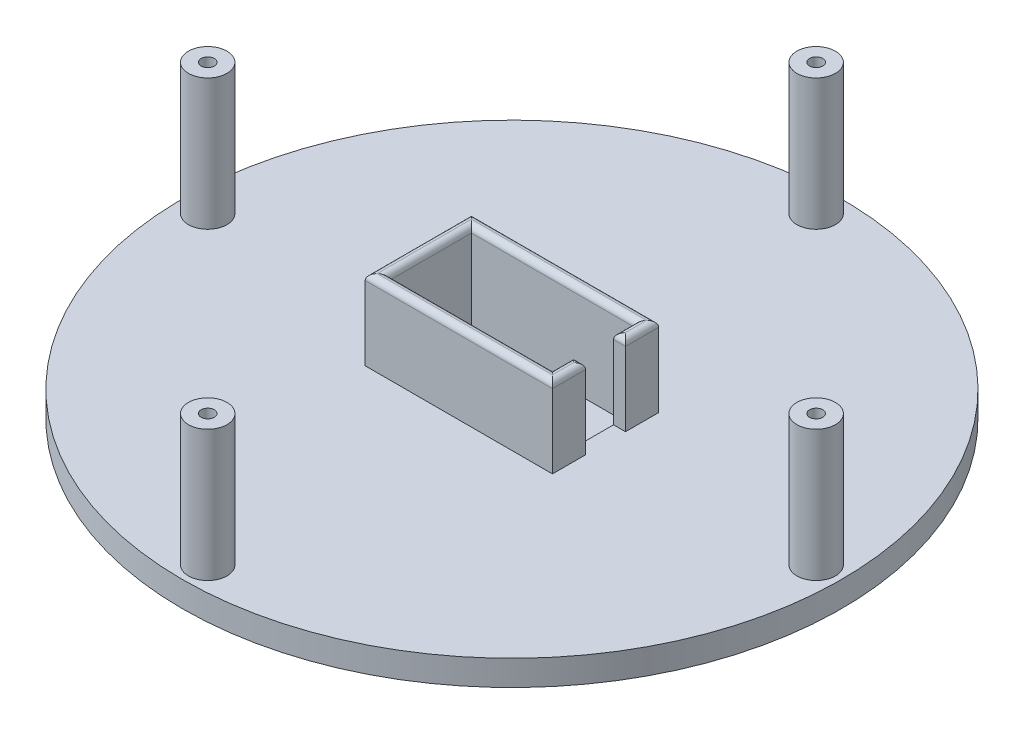
ISO-10303-21;
HEADER;
FILE_DESCRIPTION(('STEP AP214'),'2;1');
FILE_NAME('part.step','',(''),(''),'','','');
FILE_SCHEMA(('AUTOMOTIVE_DESIGN { 1 0 10303 214 1 1 1 1 }'));
ENDSEC;
DATA;
#1=APPLICATION_CONTEXT('core data for automotive mechanical design processes');
#2=APPLICATION_PROTOCOL_DEFINITION('international standard','automotive_design',2000,#1);
#3=PRODUCT_CONTEXT('',#1,'mechanical');
#4=PRODUCT('Part','Part','',(#3));
#5=PRODUCT_RELATED_PRODUCT_CATEGORY('part','',(#4));
#6=PRODUCT_DEFINITION_FORMATION('','',#4);
#7=PRODUCT_DEFINITION_CONTEXT('part definition',#1,'design');
#8=PRODUCT_DEFINITION('design','',#6,#7);
#9=PRODUCT_DEFINITION_SHAPE('','',#8);
#10=(LENGTH_UNIT() NAMED_UNIT(*) SI_UNIT(.MILLI.,.METRE.));
#11=(NAMED_UNIT(*) PLANE_ANGLE_UNIT() SI_UNIT($,.RADIAN.));
#12=(NAMED_UNIT(*) SI_UNIT($,.STERADIAN.) SOLID_ANGLE_UNIT());
#13=UNCERTAINTY_MEASURE_WITH_UNIT(LENGTH_MEASURE(1.E-05),#10,'distance_accuracy_value','');
#14=(GEOMETRIC_REPRESENTATION_CONTEXT(3) GLOBAL_UNCERTAINTY_ASSIGNED_CONTEXT((#13)) GLOBAL_UNIT_ASSIGNED_CONTEXT((#10,
#11,#12)) REPRESENTATION_CONTEXT('',''));
#15=CARTESIAN_POINT('',(0.,0.,0.));
#16=DIRECTION('',(0.,0.,1.));
#17=DIRECTION('',(1.,0.,0.));
#18=AXIS2_PLACEMENT_3D('',#15,#16,#17);
#19=CARTESIAN_POINT('',(0.,6.35,0.));
#20=DIRECTION('',(0.,1.,0.));
#21=DIRECTION('',(0.,0.,1.));
#22=AXIS2_PLACEMENT_3D('',#19,#20,#21);
#23=PLANE('',#22);
#24=CARTESIAN_POINT('',(0.,6.35,76.2));
#25=DIRECTION('',(0.,1.,0.));
#26=DIRECTION('',(0.,0.,-1.));
#27=AXIS2_PLACEMENT_3D('',#24,#25,#26);
#28=CIRCLE('',#27,4.825);
#29=CARTESIAN_POINT('',(0.,6.35,71.375));
#30=VERTEX_POINT('',#29);
#31=EDGE_CURVE('E307',#30,#30,#28,.T.);
#32=ORIENTED_EDGE('',*,*,#31,.F.);
#33=EDGE_LOOP('',(#32));
#34=FACE_BOUND('',#33,.T.);
#35=CARTESIAN_POINT('',(0.,6.35,-76.2));
#36=DIRECTION('',(0.,1.,0.));
#37=DIRECTION('',(0.,0.,1.));
#38=AXIS2_PLACEMENT_3D('',#35,#36,#37);
#39=CIRCLE('',#38,4.825);
#40=CARTESIAN_POINT('',(0.,6.35,-71.375));
#41=VERTEX_POINT('',#40);
#42=EDGE_CURVE('E289',#41,#41,#39,.T.);
#43=ORIENTED_EDGE('',*,*,#42,.F.);
#44=EDGE_LOOP('',(#43));
#45=FACE_BOUND('',#44,.T.);
#46=CARTESIAN_POINT('',(0.,6.35,0.));
#47=DIRECTION('',(0.,1.,0.));
#48=DIRECTION('',(0.,0.,1.));
#49=AXIS2_PLACEMENT_3D('',#46,#47,#48);
#50=CIRCLE('',#49,82.55);
#51=CARTESIAN_POINT('',(0.,6.35,82.55));
#52=VERTEX_POINT('',#51);
#53=EDGE_CURVE('E241',#52,#52,#50,.T.);
#54=ORIENTED_EDGE('',*,*,#53,.T.);
#55=EDGE_LOOP('',(#54));
#56=FACE_BOUND('',#55,.T.);
#57=CARTESIAN_POINT('',(76.2,6.35,-7.97374983342082E-13));
#58=DIRECTION('',(0.,1.,0.));
#59=DIRECTION('',(-1.,0.,0.));
#60=AXIS2_PLACEMENT_3D('',#57,#58,#59);
#61=CIRCLE('',#60,4.825);
#62=CARTESIAN_POINT('',(71.375,6.35,-7.46835790962327E-13));
#63=VERTEX_POINT('',#62);
#64=EDGE_CURVE('E298',#63,#63,#61,.T.);
#65=ORIENTED_EDGE('',*,*,#64,.F.);
#66=EDGE_LOOP('',(#65));
#67=FACE_BOUND('',#66,.T.);
#68=CARTESIAN_POINT('',(-76.2,6.35,2.65273227302388E-13));
#69=DIRECTION('',(0.,1.,0.));
#70=DIRECTION('',(1.,0.,0.));
#71=AXIS2_PLACEMENT_3D('',#68,#69,#70);
#72=CIRCLE('',#71,4.825);
#73=CARTESIAN_POINT('',(-71.375,6.35,2.4842682984247E-13));
#74=VERTEX_POINT('',#73);
#75=EDGE_CURVE('E316',#74,#74,#72,.T.);
#76=ORIENTED_EDGE('',*,*,#75,.F.);
#77=EDGE_LOOP('',(#76));
#78=FACE_BOUND('',#77,.T.);
#79=DIRECTION('',(0.,0.,-1.));
#80=VECTOR('',#79,1.);
#81=CARTESIAN_POINT('',(23.45,6.35,-5.));
#82=LINE('',#81,#80);
#83=CARTESIAN_POINT('',(23.45,6.35,-5.));
#84=VERTEX_POINT('',#83);
#85=CARTESIAN_POINT('',(23.45,6.35,-13.3));
#86=VERTEX_POINT('',#85);
#87=EDGE_CURVE('E174',#84,#86,#82,.T.);
#88=ORIENTED_EDGE('',*,*,#87,.F.);
#89=DIRECTION('',(1.,0.,0.));
#90=VECTOR('',#89,1.);
#91=CARTESIAN_POINT('',(20.45,6.35,-5.));
#92=LINE('',#91,#90);
#93=CARTESIAN_POINT('',(20.45,6.35,-5.));
#94=VERTEX_POINT('',#93);
#95=EDGE_CURVE('E186',#94,#84,#92,.T.);
#96=ORIENTED_EDGE('',*,*,#95,.F.);
#97=DIRECTION('',(0.,0.,-1.));
#98=VECTOR('',#97,1.);
#99=CARTESIAN_POINT('',(20.45,6.35,-10.3));
#100=LINE('',#99,#98);
#101=CARTESIAN_POINT('',(20.45,6.35,5.));
#102=VERTEX_POINT('',#101);
#103=EDGE_CURVE('E274',#102,#94,#100,.T.);
#104=ORIENTED_EDGE('',*,*,#103,.F.);
#105=DIRECTION('',(-1.,0.,0.));
#106=VECTOR('',#105,1.);
#107=CARTESIAN_POINT('',(20.45,6.35,5.));
#108=LINE('',#107,#106);
#109=CARTESIAN_POINT('',(23.45,6.35,5.));
#110=VERTEX_POINT('',#109);
#111=EDGE_CURVE('E355',#110,#102,#108,.T.);
#112=ORIENTED_EDGE('',*,*,#111,.F.);
#113=DIRECTION('',(0.,0.,-1.));
#114=VECTOR('',#113,1.);
#115=CARTESIAN_POINT('',(23.45,6.35,5.));
#116=LINE('',#115,#114);
#117=CARTESIAN_POINT('',(23.45,6.35,13.3));
#118=VERTEX_POINT('',#117);
#119=EDGE_CURVE('E358',#118,#110,#116,.T.);
#120=ORIENTED_EDGE('',*,*,#119,.F.);
#121=DIRECTION('',(1.,0.,0.));
#122=VECTOR('',#121,1.);
#123=CARTESIAN_POINT('',(-23.45,6.35,13.3));
#124=LINE('',#123,#122);
#125=CARTESIAN_POINT('',(-23.45,6.35,13.3));
#126=VERTEX_POINT('',#125);
#127=EDGE_CURVE('E361',#126,#118,#124,.T.);
#128=ORIENTED_EDGE('',*,*,#127,.F.);
#129=DIRECTION('',(0.,0.,1.));
#130=VECTOR('',#129,1.);
#131=CARTESIAN_POINT('',(-23.45,6.35,-13.3));
#132=LINE('',#131,#130);
#133=CARTESIAN_POINT('',(-23.45,6.35,-13.3));
#134=VERTEX_POINT('',#133);
#135=EDGE_CURVE('E364',#134,#126,#132,.T.);
#136=ORIENTED_EDGE('',*,*,#135,.F.);
#137=DIRECTION('',(-1.,0.,0.));
#138=VECTOR('',#137,1.);
#139=CARTESIAN_POINT('',(23.45,6.35,-13.3));
#140=LINE('',#139,#138);
#141=EDGE_CURVE('E367',#86,#134,#140,.T.);
#142=ORIENTED_EDGE('',*,*,#141,.F.);
#143=EDGE_LOOP('',(#88,#96,#104,#112,#120,#128,#136,#142));
#144=FACE_BOUND('',#143,.T.);
#145=ADVANCED_FACE('F39',(#34,#45,#56,#67,#78,#144),#23,.T.);
#146=CARTESIAN_POINT('',(0.,-0.00100000000000013,-76.2));
#147=DIRECTION('',(0.,1.,0.));
#148=DIRECTION('',(0.,0.,1.));
#149=AXIS2_PLACEMENT_3D('',#146,#147,#148);
#150=CYLINDRICAL_SURFACE('',#149,1.65);
#151=CARTESIAN_POINT('',(0.,39.174999914,-76.2));
#152=DIRECTION('',(0.,1.,0.));
#153=DIRECTION('',(0.,0.,1.));
#154=AXIS2_PLACEMENT_3D('',#151,#152,#153);
#155=CIRCLE('',#154,1.65);
#156=CARTESIAN_POINT('',(0.,39.174999914,-74.55));
#157=VERTEX_POINT('',#156);
#158=EDGE_CURVE('E292',#157,#157,#155,.T.);
#159=ORIENTED_EDGE('',*,*,#158,.T.);
#160=EDGE_LOOP('',(#159));
#161=FACE_BOUND('',#160,.T.);
#162=CARTESIAN_POINT('',(0.,20.,-76.2));
#163=DIRECTION('',(0.,-1.,0.));
#164=DIRECTION('',(0.,0.,-1.));
#165=AXIS2_PLACEMENT_3D('',#162,#163,#164);
#166=CIRCLE('',#165,1.65);
#167=CARTESIAN_POINT('',(0.,20.,-77.85));
#168=VERTEX_POINT('',#167);
#169=EDGE_CURVE('E242',#168,#168,#166,.F.);
#170=ORIENTED_EDGE('',*,*,#169,.F.);
#171=EDGE_LOOP('',(#170));
#172=FACE_BOUND('',#171,.T.);
#173=ADVANCED_FACE('F428',(#161,#172),#150,.F.);
#174=CARTESIAN_POINT('',(76.2,-0.00100000000000013,-7.97374983342082E-13));
#175=DIRECTION('',(0.,1.,0.));
#176=DIRECTION('',(0.,0.,1.));
#177=AXIS2_PLACEMENT_3D('',#174,#175,#176);
#178=CYLINDRICAL_SURFACE('',#177,1.65);
#179=CARTESIAN_POINT('',(76.2,39.174999914,-7.97374983342082E-13));
#180=DIRECTION('',(0.,1.,0.));
#181=DIRECTION('',(-1.,0.,0.));
#182=AXIS2_PLACEMENT_3D('',#179,#180,#181);
#183=CIRCLE('',#182,1.65);
#184=CARTESIAN_POINT('',(74.55,39.174999914,-7.80092150714808E-13));
#185=VERTEX_POINT('',#184);
#186=EDGE_CURVE('E256',#185,#185,#183,.T.);
#187=ORIENTED_EDGE('',*,*,#186,.T.);
#188=EDGE_LOOP('',(#187));
#189=FACE_BOUND('',#188,.T.);
#190=CARTESIAN_POINT('',(76.2,20.,-7.97374983342082E-13));
#191=DIRECTION('',(0.,-1.,0.));
#192=DIRECTION('',(0.,0.,-1.));
#193=AXIS2_PLACEMENT_3D('',#190,#191,#192);
#194=CIRCLE('',#193,1.65);
#195=CARTESIAN_POINT('',(76.2,20.,-1.6500000000008));
#196=VERTEX_POINT('',#195);
#197=EDGE_CURVE('E246',#196,#196,#194,.F.);
#198=ORIENTED_EDGE('',*,*,#197,.F.);
#199=EDGE_LOOP('',(#198));
#200=FACE_BOUND('',#199,.T.);
#201=ADVANCED_FACE('F436',(#189,#200),#178,.F.);
#202=CARTESIAN_POINT('',(0.,-0.00100000000000013,76.2));
#203=DIRECTION('',(0.,1.,0.));
#204=DIRECTION('',(0.,0.,1.));
#205=AXIS2_PLACEMENT_3D('',#202,#203,#204);
#206=CYLINDRICAL_SURFACE('',#205,1.65);
#207=CARTESIAN_POINT('',(0.,39.174999914,76.2));
#208=DIRECTION('',(0.,1.,0.));
#209=DIRECTION('',(0.,0.,-1.));
#210=AXIS2_PLACEMENT_3D('',#207,#208,#209);
#211=CIRCLE('',#210,1.65);
#212=CARTESIAN_POINT('',(0.,39.174999914,74.55));
#213=VERTEX_POINT('',#212);
#214=EDGE_CURVE('E304',#213,#213,#211,.T.);
#215=ORIENTED_EDGE('',*,*,#214,.T.);
#216=EDGE_LOOP('',(#215));
#217=FACE_BOUND('',#216,.T.);
#218=CARTESIAN_POINT('',(0.,20.,76.2));
#219=DIRECTION('',(0.,-1.,0.));
#220=DIRECTION('',(0.,0.,-1.));
#221=AXIS2_PLACEMENT_3D('',#218,#219,#220);
#222=CIRCLE('',#221,1.65);
#223=CARTESIAN_POINT('',(0.,20.,74.55));
#224=VERTEX_POINT('',#223);
#225=EDGE_CURVE('E249',#224,#224,#222,.F.);
#226=ORIENTED_EDGE('',*,*,#225,.F.);
#227=EDGE_LOOP('',(#226));
#228=FACE_BOUND('',#227,.T.);
#229=ADVANCED_FACE('F658',(#217,#228),#206,.F.);
#230=CARTESIAN_POINT('',(-76.2,-0.00100000000000013,2.65273227302388E-13));
#231=DIRECTION('',(0.,1.,0.));
#232=DIRECTION('',(0.,0.,1.));
#233=AXIS2_PLACEMENT_3D('',#230,#231,#232);
#234=CYLINDRICAL_SURFACE('',#233,1.65);
#235=CARTESIAN_POINT('',(-76.2,39.174999914,2.65273227302388E-13));
#236=DIRECTION('',(0.,1.,0.));
#237=DIRECTION('',(1.,0.,0.));
#238=AXIS2_PLACEMENT_3D('',#235,#236,#237);
#239=CIRCLE('',#238,1.65);
#240=CARTESIAN_POINT('',(-74.55,39.174999914,2.59512283093297E-13));
#241=VERTEX_POINT('',#240);
#242=EDGE_CURVE('E313',#241,#241,#239,.T.);
#243=ORIENTED_EDGE('',*,*,#242,.T.);
#244=EDGE_LOOP('',(#243));
#245=FACE_BOUND('',#244,.T.);
#246=CARTESIAN_POINT('',(-76.2,20.,2.65273227302388E-13));
#247=DIRECTION('',(0.,-1.,0.));
#248=DIRECTION('',(0.,0.,-1.));
#249=AXIS2_PLACEMENT_3D('',#246,#247,#248);
#250=CIRCLE('',#249,1.65);
#251=CARTESIAN_POINT('',(-76.2,20.,-1.64999999999973));
#252=VERTEX_POINT('',#251);
#253=EDGE_CURVE('E253',#252,#252,#250,.F.);
#254=ORIENTED_EDGE('',*,*,#253,.F.);
#255=EDGE_LOOP('',(#254));
#256=FACE_BOUND('',#255,.T.);
#257=ADVANCED_FACE('F451',(#245,#256),#234,.F.);
#258=CARTESIAN_POINT('',(0.,6.35,0.));
#259=DIRECTION('',(0.,-1.,0.));
#260=DIRECTION('',(0.,0.,-1.));
#261=AXIS2_PLACEMENT_3D('',#258,#259,#260);
#262=CYLINDRICAL_SURFACE('',#261,82.55);
#263=ORIENTED_EDGE('',*,*,#53,.F.);
#264=EDGE_LOOP('',(#263));
#265=FACE_BOUND('',#264,.T.);
#266=CARTESIAN_POINT('',(0.,0.,0.));
#267=DIRECTION('',(0.,1.,0.));
#268=DIRECTION('',(0.,0.,1.));
#269=AXIS2_PLACEMENT_3D('',#266,#267,#268);
#270=CIRCLE('',#269,82.55);
#271=CARTESIAN_POINT('',(0.,0.,82.55));
#272=VERTEX_POINT('',#271);
#273=EDGE_CURVE('E258',#272,#272,#270,.T.);
#274=ORIENTED_EDGE('',*,*,#273,.T.);
#275=EDGE_LOOP('',(#274));
#276=FACE_BOUND('',#275,.T.);
#277=ADVANCED_FACE('F447',(#265,#276),#262,.T.);
#278=CARTESIAN_POINT('',(0.,0.,0.));
#279=DIRECTION('',(0.,1.,0.));
#280=DIRECTION('',(0.,0.,1.));
#281=AXIS2_PLACEMENT_3D('',#278,#279,#280);
#282=PLANE('',#281);
#283=CARTESIAN_POINT('',(5.31324105322235E-13,0.,76.2));
#284=DIRECTION('',(0.,-1.,0.));
#285=DIRECTION('',(-1.,0.,0.));
#286=AXIS2_PLACEMENT_3D('',#283,#284,#285);
#287=CIRCLE('',#286,2.9);
#288=CARTESIAN_POINT('',(-2.89999999999947,0.,76.2));
#289=VERTEX_POINT('',#288);
#290=EDGE_CURVE('E339',#289,#289,#287,.T.);
#291=ORIENTED_EDGE('',*,*,#290,.F.);
#292=EDGE_LOOP('',(#291));
#293=FACE_BOUND('',#292,.T.);
#294=CARTESIAN_POINT('',(76.2,0.,-2.65273227302388E-13));
#295=DIRECTION('',(0.,-1.,0.));
#296=DIRECTION('',(0.,0.,1.));
#297=AXIS2_PLACEMENT_3D('',#294,#295,#296);
#298=CIRCLE('',#297,2.9);
#299=CARTESIAN_POINT('',(76.2,0.,2.89999999999973));
#300=VERTEX_POINT('',#299);
#301=EDGE_CURVE('E333',#300,#300,#298,.T.);
#302=ORIENTED_EDGE('',*,*,#301,.F.);
#303=EDGE_LOOP('',(#302));
#304=FACE_BOUND('',#303,.T.);
#305=CARTESIAN_POINT('',(-1.06342586136193E-12,0.,-76.2));
#306=DIRECTION('',(0.,-1.,0.));
#307=DIRECTION('',(1.,0.,0.));
#308=AXIS2_PLACEMENT_3D('',#305,#306,#307);
#309=CIRCLE('',#308,2.9);
#310=CARTESIAN_POINT('',(2.89999999999894,0.,-76.2));
#311=VERTEX_POINT('',#310);
#312=EDGE_CURVE('E327',#311,#311,#309,.T.);
#313=ORIENTED_EDGE('',*,*,#312,.F.);
#314=EDGE_LOOP('',(#313));
#315=FACE_BOUND('',#314,.T.);
#316=CARTESIAN_POINT('',(-76.2,0.,2.65273227302388E-13));
#317=DIRECTION('',(0.,-1.,0.));
#318=DIRECTION('',(0.,0.,-1.));
#319=AXIS2_PLACEMENT_3D('',#316,#317,#318);
#320=CIRCLE('',#319,2.9);
#321=CARTESIAN_POINT('',(-76.2,0.,-2.89999999999973));
#322=VERTEX_POINT('',#321);
#323=EDGE_CURVE('E245',#322,#322,#320,.T.);
#324=ORIENTED_EDGE('',*,*,#323,.F.);
#325=EDGE_LOOP('',(#324));
#326=FACE_BOUND('',#325,.T.);
#327=ORIENTED_EDGE('',*,*,#273,.F.);
#328=EDGE_LOOP('',(#327));
#329=FACE_BOUND('',#328,.T.);
#330=ADVANCED_FACE('F444',(#293,#304,#315,#326,#329),#282,.F.);
#331=CARTESIAN_POINT('',(20.45,3.175,-10.3));
#332=DIRECTION('',(1.,0.,0.));
#333=DIRECTION('',(0.,0.,-1.));
#334=AXIS2_PLACEMENT_3D('',#331,#332,#333);
#335=PLANE('',#334);
#336=DIRECTION('',(0.,1.,0.));
#337=VECTOR('',#336,1.);
#338=CARTESIAN_POINT('',(20.45,3.175,10.3));
#339=LINE('',#338,#337);
#340=CARTESIAN_POINT('',(20.45,3.175,10.3));
#341=VERTEX_POINT('',#340);
#342=CARTESIAN_POINT('',(20.45,24.85,10.3));
#343=VERTEX_POINT('',#342);
#344=EDGE_CURVE('E261',#341,#343,#339,.T.);
#345=ORIENTED_EDGE('',*,*,#344,.T.);
#346=DIRECTION('',(0.,0.,1.));
#347=VECTOR('',#346,1.);
#348=CARTESIAN_POINT('',(20.45,24.85,-10.3));
#349=LINE('',#348,#347);
#350=CARTESIAN_POINT('',(20.45,24.85,5.));
#351=VERTEX_POINT('',#350);
#352=EDGE_CURVE('E234',#343,#351,#349,.F.);
#353=ORIENTED_EDGE('',*,*,#352,.T.);
#354=DIRECTION('',(0.,-1.,0.));
#355=VECTOR('',#354,1.);
#356=CARTESIAN_POINT('',(20.45,26.35,5.));
#357=LINE('',#356,#355);
#358=EDGE_CURVE('E353',#351,#102,#357,.T.);
#359=ORIENTED_EDGE('',*,*,#358,.T.);
#360=ORIENTED_EDGE('',*,*,#103,.T.);
#361=DIRECTION('',(0.,-1.,0.));
#362=VECTOR('',#361,1.);
#363=CARTESIAN_POINT('',(20.45,26.35,-5.));
#364=LINE('',#363,#362);
#365=CARTESIAN_POINT('',(20.45,24.85,-5.));
#366=VERTEX_POINT('',#365);
#367=EDGE_CURVE('E96',#366,#94,#364,.T.);
#368=ORIENTED_EDGE('',*,*,#367,.F.);
#369=DIRECTION('',(0.,0.,1.));
#370=VECTOR('',#369,1.);
#371=CARTESIAN_POINT('',(20.45,24.85,-10.3));
#372=LINE('',#371,#370);
#373=CARTESIAN_POINT('',(20.45,24.85,-10.3));
#374=VERTEX_POINT('',#373);
#375=EDGE_CURVE('E236',#366,#374,#372,.F.);
#376=ORIENTED_EDGE('',*,*,#375,.T.);
#377=DIRECTION('',(0.,1.,0.));
#378=VECTOR('',#377,1.);
#379=CARTESIAN_POINT('',(20.45,3.175,-10.3));
#380=LINE('',#379,#378);
#381=CARTESIAN_POINT('',(20.45,3.175,-10.3));
#382=VERTEX_POINT('',#381);
#383=EDGE_CURVE('E264',#382,#374,#380,.T.);
#384=ORIENTED_EDGE('',*,*,#383,.F.);
#385=DIRECTION('',(0.,0.,-1.));
#386=VECTOR('',#385,1.);
#387=CARTESIAN_POINT('',(20.45,3.175,-10.3));
#388=LINE('',#387,#386);
#389=EDGE_CURVE('E277',#341,#382,#388,.T.);
#390=ORIENTED_EDGE('',*,*,#389,.F.);
#391=EDGE_LOOP('',(#345,#353,#359,#360,#368,#376,#384,#390));
#392=FACE_BOUND('',#391,.T.);
#393=ADVANCED_FACE('F405',(#392),#335,.F.);
#394=CARTESIAN_POINT('',(-20.45,3.175,10.3));
#395=DIRECTION('',(0.,0.,1.));
#396=DIRECTION('',(1.,0.,0.));
#397=AXIS2_PLACEMENT_3D('',#394,#395,#396);
#398=PLANE('',#397);
#399=DIRECTION('',(0.,1.,0.));
#400=VECTOR('',#399,1.);
#401=CARTESIAN_POINT('',(-20.45,3.175,10.3));
#402=LINE('',#401,#400);
#403=CARTESIAN_POINT('',(-20.45,3.175,10.3));
#404=VERTEX_POINT('',#403);
#405=CARTESIAN_POINT('',(-20.45,24.85,10.3));
#406=VERTEX_POINT('',#405);
#407=EDGE_CURVE('E269',#404,#406,#402,.T.);
#408=ORIENTED_EDGE('',*,*,#407,.T.);
#409=DIRECTION('',(-1.,0.,0.));
#410=VECTOR('',#409,1.);
#411=CARTESIAN_POINT('',(-20.45,24.85,10.3));
#412=LINE('',#411,#410);
#413=EDGE_CURVE('E238',#406,#343,#412,.F.);
#414=ORIENTED_EDGE('',*,*,#413,.T.);
#415=ORIENTED_EDGE('',*,*,#344,.F.);
#416=DIRECTION('',(1.,0.,0.));
#417=VECTOR('',#416,1.);
#418=CARTESIAN_POINT('',(-20.45,3.175,10.3));
#419=LINE('',#418,#417);
#420=EDGE_CURVE('E267',#404,#341,#419,.T.);
#421=ORIENTED_EDGE('',*,*,#420,.F.);
#422=EDGE_LOOP('',(#408,#414,#415,#421));
#423=FACE_BOUND('',#422,.T.);
#424=ADVANCED_FACE('F551',(#423),#398,.F.);
#425=CARTESIAN_POINT('',(-20.45,3.175,-10.3));
#426=DIRECTION('',(-1.,0.,0.));
#427=DIRECTION('',(0.,0.,1.));
#428=AXIS2_PLACEMENT_3D('',#425,#426,#427);
#429=PLANE('',#428);
#430=DIRECTION('',(0.,1.,0.));
#431=VECTOR('',#430,1.);
#432=CARTESIAN_POINT('',(-20.45,3.175,-10.3));
#433=LINE('',#432,#431);
#434=CARTESIAN_POINT('',(-20.45,3.175,-10.3));
#435=VERTEX_POINT('',#434);
#436=CARTESIAN_POINT('',(-20.45,24.85,-10.3));
#437=VERTEX_POINT('',#436);
#438=EDGE_CURVE('E266',#435,#437,#433,.T.);
#439=ORIENTED_EDGE('',*,*,#438,.T.);
#440=DIRECTION('',(0.,0.,-1.));
#441=VECTOR('',#440,1.);
#442=CARTESIAN_POINT('',(-20.45,24.85,-10.3));
#443=LINE('',#442,#441);
#444=EDGE_CURVE('E11',#437,#406,#443,.F.);
#445=ORIENTED_EDGE('',*,*,#444,.T.);
#446=ORIENTED_EDGE('',*,*,#407,.F.);
#447=DIRECTION('',(0.,0.,1.));
#448=VECTOR('',#447,1.);
#449=CARTESIAN_POINT('',(-20.45,3.175,-10.3));
#450=LINE('',#449,#448);
#451=EDGE_CURVE('E281',#435,#404,#450,.T.);
#452=ORIENTED_EDGE('',*,*,#451,.F.);
#453=EDGE_LOOP('',(#439,#445,#446,#452));
#454=FACE_BOUND('',#453,.T.);
#455=ADVANCED_FACE('F540',(#454),#429,.F.);
#456=CARTESIAN_POINT('',(-20.45,3.175,-10.3));
#457=DIRECTION('',(0.,0.,-1.));
#458=DIRECTION('',(-1.,0.,0.));
#459=AXIS2_PLACEMENT_3D('',#456,#457,#458);
#460=PLANE('',#459);
#461=ORIENTED_EDGE('',*,*,#383,.T.);
#462=DIRECTION('',(1.,0.,0.));
#463=VECTOR('',#462,1.);
#464=CARTESIAN_POINT('',(-20.45,24.85,-10.3));
#465=LINE('',#464,#463);
#466=EDGE_CURVE('E49',#374,#437,#465,.F.);
#467=ORIENTED_EDGE('',*,*,#466,.T.);
#468=ORIENTED_EDGE('',*,*,#438,.F.);
#469=DIRECTION('',(-1.,0.,0.));
#470=VECTOR('',#469,1.);
#471=CARTESIAN_POINT('',(-20.45,3.175,-10.3));
#472=LINE('',#471,#470);
#473=EDGE_CURVE('E284',#382,#435,#472,.T.);
#474=ORIENTED_EDGE('',*,*,#473,.F.);
#475=EDGE_LOOP('',(#461,#467,#468,#474));
#476=FACE_BOUND('',#475,.T.);
#477=ADVANCED_FACE('F534',(#476),#460,.F.);
#478=CARTESIAN_POINT('',(0.,3.175,0.));
#479=DIRECTION('',(0.,1.,0.));
#480=DIRECTION('',(0.,0.,1.));
#481=AXIS2_PLACEMENT_3D('',#478,#479,#480);
#482=PLANE('',#481);
#483=ORIENTED_EDGE('',*,*,#389,.T.);
#484=ORIENTED_EDGE('',*,*,#473,.T.);
#485=ORIENTED_EDGE('',*,*,#451,.T.);
#486=ORIENTED_EDGE('',*,*,#420,.T.);
#487=EDGE_LOOP('',(#483,#484,#485,#486));
#488=FACE_BOUND('',#487,.T.);
#489=ADVANCED_FACE('F539',(#488),#482,.T.);
#490=CARTESIAN_POINT('',(0.,39.174999914,-76.2));
#491=DIRECTION('',(0.,1.,0.));
#492=DIRECTION('',(0.,0.,1.));
#493=AXIS2_PLACEMENT_3D('',#490,#491,#492);
#494=PLANE('',#493);
#495=CARTESIAN_POINT('',(0.,39.174999914,-76.2));
#496=DIRECTION('',(0.,1.,0.));
#497=DIRECTION('',(0.,0.,1.));
#498=AXIS2_PLACEMENT_3D('',#495,#496,#497);
#499=CIRCLE('',#498,4.825);
#500=CARTESIAN_POINT('',(0.,39.174999914,-71.375));
#501=VERTEX_POINT('',#500);
#502=EDGE_CURVE('E278',#501,#501,#499,.T.);
#503=ORIENTED_EDGE('',*,*,#502,.T.);
#504=EDGE_LOOP('',(#503));
#505=FACE_BOUND('',#504,.T.);
#506=ORIENTED_EDGE('',*,*,#158,.F.);
#507=EDGE_LOOP('',(#506));
#508=FACE_BOUND('',#507,.T.);
#509=ADVANCED_FACE('F760',(#505,#508),#494,.T.);
#510=CARTESIAN_POINT('',(0.,39.174999914,-76.2));
#511=DIRECTION('',(0.,-1.,0.));
#512=DIRECTION('',(0.,0.,-1.));
#513=AXIS2_PLACEMENT_3D('',#510,#511,#512);
#514=CYLINDRICAL_SURFACE('',#513,4.825);
#515=ORIENTED_EDGE('',*,*,#502,.F.);
#516=EDGE_LOOP('',(#515));
#517=FACE_BOUND('',#516,.T.);
#518=ORIENTED_EDGE('',*,*,#42,.T.);
#519=EDGE_LOOP('',(#518));
#520=FACE_BOUND('',#519,.T.);
#521=ADVANCED_FACE('F751',(#517,#520),#514,.T.);
#522=CARTESIAN_POINT('',(-76.2,39.174999914,2.65273227302388E-13));
#523=DIRECTION('',(0.,1.,0.));
#524=DIRECTION('',(1.,0.,0.));
#525=AXIS2_PLACEMENT_3D('',#522,#523,#524);
#526=PLANE('',#525);
#527=CARTESIAN_POINT('',(-76.2,39.174999914,2.65273227302388E-13));
#528=DIRECTION('',(0.,1.,0.));
#529=DIRECTION('',(1.,0.,0.));
#530=AXIS2_PLACEMENT_3D('',#527,#528,#529);
#531=CIRCLE('',#530,4.825);
#532=CARTESIAN_POINT('',(-71.375,39.174999914,2.4842682984247E-13));
#533=VERTEX_POINT('',#532);
#534=EDGE_CURVE('E297',#533,#533,#531,.T.);
#535=ORIENTED_EDGE('',*,*,#534,.T.);
#536=EDGE_LOOP('',(#535));
#537=FACE_BOUND('',#536,.T.);
#538=ORIENTED_EDGE('',*,*,#242,.F.);
#539=EDGE_LOOP('',(#538));
#540=FACE_BOUND('',#539,.T.);
#541=ADVANCED_FACE('F742',(#537,#540),#526,.T.);
#542=CARTESIAN_POINT('',(-76.2,39.174999914,2.65273227302388E-13));
#543=DIRECTION('',(0.,-1.,0.));
#544=DIRECTION('',(0.,0.,-1.));
#545=AXIS2_PLACEMENT_3D('',#542,#543,#544);
#546=CYLINDRICAL_SURFACE('',#545,4.825);
#547=ORIENTED_EDGE('',*,*,#534,.F.);
#548=EDGE_LOOP('',(#547));
#549=FACE_BOUND('',#548,.T.);
#550=ORIENTED_EDGE('',*,*,#75,.T.);
#551=EDGE_LOOP('',(#550));
#552=FACE_BOUND('',#551,.T.);
#553=ADVANCED_FACE('F733',(#549,#552),#546,.T.);
#554=CARTESIAN_POINT('',(0.,39.174999914,76.2));
#555=DIRECTION('',(0.,1.,0.));
#556=DIRECTION('',(0.,0.,-1.));
#557=AXIS2_PLACEMENT_3D('',#554,#555,#556);
#558=PLANE('',#557);
#559=CARTESIAN_POINT('',(0.,39.174999914,76.2));
#560=DIRECTION('',(0.,1.,0.));
#561=DIRECTION('',(0.,0.,-1.));
#562=AXIS2_PLACEMENT_3D('',#559,#560,#561);
#563=CIRCLE('',#562,4.825);
#564=CARTESIAN_POINT('',(0.,39.174999914,71.375));
#565=VERTEX_POINT('',#564);
#566=EDGE_CURVE('E310',#565,#565,#563,.T.);
#567=ORIENTED_EDGE('',*,*,#566,.T.);
#568=EDGE_LOOP('',(#567));
#569=FACE_BOUND('',#568,.T.);
#570=ORIENTED_EDGE('',*,*,#214,.F.);
#571=EDGE_LOOP('',(#570));
#572=FACE_BOUND('',#571,.T.);
#573=ADVANCED_FACE('F724',(#569,#572),#558,.T.);
#574=CARTESIAN_POINT('',(0.,39.174999914,76.2));
#575=DIRECTION('',(0.,-1.,0.));
#576=DIRECTION('',(0.,0.,-1.));
#577=AXIS2_PLACEMENT_3D('',#574,#575,#576);
#578=CYLINDRICAL_SURFACE('',#577,4.825);
#579=ORIENTED_EDGE('',*,*,#566,.F.);
#580=EDGE_LOOP('',(#579));
#581=FACE_BOUND('',#580,.T.);
#582=ORIENTED_EDGE('',*,*,#31,.T.);
#583=EDGE_LOOP('',(#582));
#584=FACE_BOUND('',#583,.T.);
#585=ADVANCED_FACE('F715',(#581,#584),#578,.T.);
#586=CARTESIAN_POINT('',(76.2,39.174999914,-7.97374983342082E-13));
#587=DIRECTION('',(0.,1.,0.));
#588=DIRECTION('',(-1.,0.,0.));
#589=AXIS2_PLACEMENT_3D('',#586,#587,#588);
#590=PLANE('',#589);
#591=CARTESIAN_POINT('',(76.2,39.174999914,-7.97374983342082E-13));
#592=DIRECTION('',(0.,1.,0.));
#593=DIRECTION('',(-1.,0.,0.));
#594=AXIS2_PLACEMENT_3D('',#591,#592,#593);
#595=CIRCLE('',#594,4.825);
#596=CARTESIAN_POINT('',(71.375,39.174999914,-7.46835790962327E-13));
#597=VERTEX_POINT('',#596);
#598=EDGE_CURVE('E301',#597,#597,#595,.T.);
#599=ORIENTED_EDGE('',*,*,#598,.T.);
#600=EDGE_LOOP('',(#599));
#601=FACE_BOUND('',#600,.T.);
#602=ORIENTED_EDGE('',*,*,#186,.F.);
#603=EDGE_LOOP('',(#602));
#604=FACE_BOUND('',#603,.T.);
#605=ADVANCED_FACE('F706',(#601,#604),#590,.T.);
#606=CARTESIAN_POINT('',(76.2,39.174999914,-7.97374983342082E-13));
#607=DIRECTION('',(0.,-1.,0.));
#608=DIRECTION('',(0.,0.,-1.));
#609=AXIS2_PLACEMENT_3D('',#606,#607,#608);
#610=CYLINDRICAL_SURFACE('',#609,4.825);
#611=ORIENTED_EDGE('',*,*,#598,.F.);
#612=EDGE_LOOP('',(#611));
#613=FACE_BOUND('',#612,.T.);
#614=ORIENTED_EDGE('',*,*,#64,.T.);
#615=EDGE_LOOP('',(#614));
#616=FACE_BOUND('',#615,.T.);
#617=ADVANCED_FACE('F687',(#613,#616),#610,.T.);
#618=CARTESIAN_POINT('',(-76.2,20.,2.65273227302388E-13));
#619=DIRECTION('',(0.,-1.,0.));
#620=DIRECTION('',(0.,0.,-1.));
#621=AXIS2_PLACEMENT_3D('',#618,#619,#620);
#622=PLANE('',#621);
#623=CARTESIAN_POINT('',(-76.2,20.,2.65273227302388E-13));
#624=DIRECTION('',(0.,-1.,0.));
#625=DIRECTION('',(0.,0.,-1.));
#626=AXIS2_PLACEMENT_3D('',#623,#624,#625);
#627=CIRCLE('',#626,2.9);
#628=CARTESIAN_POINT('',(-76.2,20.,-2.89999999999973));
#629=VERTEX_POINT('',#628);
#630=EDGE_CURVE('E257',#629,#629,#627,.T.);
#631=ORIENTED_EDGE('',*,*,#630,.T.);
#632=EDGE_LOOP('',(#631));
#633=FACE_BOUND('',#632,.T.);
#634=ORIENTED_EDGE('',*,*,#253,.T.);
#635=EDGE_LOOP('',(#634));
#636=FACE_BOUND('',#635,.T.);
#637=ADVANCED_FACE('F678',(#633,#636),#622,.T.);
#638=CARTESIAN_POINT('',(-76.2,20.,2.65273227302388E-13));
#639=DIRECTION('',(0.,-1.,0.));
#640=DIRECTION('',(0.,0.,-1.));
#641=AXIS2_PLACEMENT_3D('',#638,#639,#640);
#642=CYLINDRICAL_SURFACE('',#641,2.9);
#643=ORIENTED_EDGE('',*,*,#630,.F.);
#644=EDGE_LOOP('',(#643));
#645=FACE_BOUND('',#644,.T.);
#646=ORIENTED_EDGE('',*,*,#323,.T.);
#647=EDGE_LOOP('',(#646));
#648=FACE_BOUND('',#647,.T.);
#649=ADVANCED_FACE('F639',(#645,#648),#642,.F.);
#650=CARTESIAN_POINT('',(5.31324105322235E-13,20.,76.2));
#651=DIRECTION('',(0.,-1.,0.));
#652=DIRECTION('',(-1.,0.,0.));
#653=AXIS2_PLACEMENT_3D('',#650,#651,#652);
#654=PLANE('',#653);
#655=CARTESIAN_POINT('',(5.31324105322235E-13,20.,76.2));
#656=DIRECTION('',(0.,-1.,0.));
#657=DIRECTION('',(-1.,0.,0.));
#658=AXIS2_PLACEMENT_3D('',#655,#656,#657);
#659=CIRCLE('',#658,2.9);
#660=CARTESIAN_POINT('',(-2.89999999999947,20.,76.2));
#661=VERTEX_POINT('',#660);
#662=EDGE_CURVE('E252',#661,#661,#659,.T.);
#663=ORIENTED_EDGE('',*,*,#662,.T.);
#664=EDGE_LOOP('',(#663));
#665=FACE_BOUND('',#664,.T.);
#666=ORIENTED_EDGE('',*,*,#225,.T.);
#667=EDGE_LOOP('',(#666));
#668=FACE_BOUND('',#667,.T.);
#669=ADVANCED_FACE('F629',(#665,#668),#654,.T.);
#670=CARTESIAN_POINT('',(5.31324105322235E-13,20.,76.2));
#671=DIRECTION('',(0.,-1.,0.));
#672=DIRECTION('',(0.,0.,-1.));
#673=AXIS2_PLACEMENT_3D('',#670,#671,#672);
#674=CYLINDRICAL_SURFACE('',#673,2.9);
#675=ORIENTED_EDGE('',*,*,#662,.F.);
#676=EDGE_LOOP('',(#675));
#677=FACE_BOUND('',#676,.T.);
#678=ORIENTED_EDGE('',*,*,#290,.T.);
#679=EDGE_LOOP('',(#678));
#680=FACE_BOUND('',#679,.T.);
#681=ADVANCED_FACE('F619',(#677,#680),#674,.F.);
#682=CARTESIAN_POINT('',(76.2,20.,-2.65273227302388E-13));
#683=DIRECTION('',(0.,-1.,0.));
#684=DIRECTION('',(0.,0.,1.));
#685=AXIS2_PLACEMENT_3D('',#682,#683,#684);
#686=PLANE('',#685);
#687=CARTESIAN_POINT('',(76.2,20.,-2.65273227302388E-13));
#688=DIRECTION('',(0.,-1.,0.));
#689=DIRECTION('',(0.,0.,1.));
#690=AXIS2_PLACEMENT_3D('',#687,#688,#689);
#691=CIRCLE('',#690,2.9);
#692=CARTESIAN_POINT('',(76.2,20.,2.89999999999973));
#693=VERTEX_POINT('',#692);
#694=EDGE_CURVE('E336',#693,#693,#691,.T.);
#695=ORIENTED_EDGE('',*,*,#694,.T.);
#696=EDGE_LOOP('',(#695));
#697=FACE_BOUND('',#696,.T.);
#698=ORIENTED_EDGE('',*,*,#197,.T.);
#699=EDGE_LOOP('',(#698));
#700=FACE_BOUND('',#699,.T.);
#701=ADVANCED_FACE('F609',(#697,#700),#686,.T.);
#702=CARTESIAN_POINT('',(76.2,20.,-2.65273227302388E-13));
#703=DIRECTION('',(0.,-1.,0.));
#704=DIRECTION('',(0.,0.,-1.));
#705=AXIS2_PLACEMENT_3D('',#702,#703,#704);
#706=CYLINDRICAL_SURFACE('',#705,2.9);
#707=ORIENTED_EDGE('',*,*,#694,.F.);
#708=EDGE_LOOP('',(#707));
#709=FACE_BOUND('',#708,.T.);
#710=ORIENTED_EDGE('',*,*,#301,.T.);
#711=EDGE_LOOP('',(#710));
#712=FACE_BOUND('',#711,.T.);
#713=ADVANCED_FACE('F599',(#709,#712),#706,.F.);
#714=CARTESIAN_POINT('',(-1.06342586136193E-12,20.,-76.2));
#715=DIRECTION('',(0.,-1.,0.));
#716=DIRECTION('',(1.,0.,0.));
#717=AXIS2_PLACEMENT_3D('',#714,#715,#716);
#718=PLANE('',#717);
#719=CARTESIAN_POINT('',(-1.06342586136193E-12,20.,-76.2));
#720=DIRECTION('',(0.,-1.,0.));
#721=DIRECTION('',(1.,0.,0.));
#722=AXIS2_PLACEMENT_3D('',#719,#720,#721);
#723=CIRCLE('',#722,2.9);
#724=CARTESIAN_POINT('',(2.89999999999894,20.,-76.2));
#725=VERTEX_POINT('',#724);
#726=EDGE_CURVE('E330',#725,#725,#723,.T.);
#727=ORIENTED_EDGE('',*,*,#726,.T.);
#728=EDGE_LOOP('',(#727));
#729=FACE_BOUND('',#728,.T.);
#730=ORIENTED_EDGE('',*,*,#169,.T.);
#731=EDGE_LOOP('',(#730));
#732=FACE_BOUND('',#731,.T.);
#733=ADVANCED_FACE('F589',(#729,#732),#718,.T.);
#734=CARTESIAN_POINT('',(-1.06342586136193E-12,20.,-76.2));
#735=DIRECTION('',(0.,-1.,0.));
#736=DIRECTION('',(0.,0.,-1.));
#737=AXIS2_PLACEMENT_3D('',#734,#735,#736);
#738=CYLINDRICAL_SURFACE('',#737,2.9);
#739=ORIENTED_EDGE('',*,*,#726,.F.);
#740=EDGE_LOOP('',(#739));
#741=FACE_BOUND('',#740,.T.);
#742=ORIENTED_EDGE('',*,*,#312,.T.);
#743=EDGE_LOOP('',(#742));
#744=FACE_BOUND('',#743,.T.);
#745=ADVANCED_FACE('F529',(#741,#744),#738,.F.);
#746=CARTESIAN_POINT('',(20.45,26.35,-5.));
#747=DIRECTION('',(0.,0.,-1.));
#748=DIRECTION('',(-1.,0.,0.));
#749=AXIS2_PLACEMENT_3D('',#746,#747,#748);
#750=PLANE('',#749);
#751=DIRECTION('',(0.,-1.,0.));
#752=VECTOR('',#751,1.);
#753=CARTESIAN_POINT('',(23.45,26.35,-5.));
#754=LINE('',#753,#752);
#755=CARTESIAN_POINT('',(23.45,24.85,-5.));
#756=VERTEX_POINT('',#755);
#757=EDGE_CURVE('E176',#756,#84,#754,.T.);
#758=ORIENTED_EDGE('',*,*,#757,.F.);
#759=DIRECTION('',(1.,0.,0.));
#760=VECTOR('',#759,1.);
#761=CARTESIAN_POINT('',(20.45,24.85,-5.));
#762=LINE('',#761,#760);
#763=EDGE_CURVE('E178',#756,#366,#762,.F.);
#764=ORIENTED_EDGE('',*,*,#763,.T.);
#765=ORIENTED_EDGE('',*,*,#367,.T.);
#766=ORIENTED_EDGE('',*,*,#95,.T.);
#767=EDGE_LOOP('',(#758,#764,#765,#766));
#768=FACE_BOUND('',#767,.T.);
#769=ADVANCED_FACE('F370',(#768),#750,.F.);
#770=CARTESIAN_POINT('',(23.45,26.35,-5.));
#771=DIRECTION('',(-1.,0.,0.));
#772=DIRECTION('',(0.,0.,1.));
#773=AXIS2_PLACEMENT_3D('',#770,#771,#772);
#774=PLANE('',#773);
#775=DIRECTION('',(0.,-1.,0.));
#776=VECTOR('',#775,1.);
#777=CARTESIAN_POINT('',(23.45,26.35,-13.3));
#778=LINE('',#777,#776);
#779=CARTESIAN_POINT('',(23.45,24.85,-13.3));
#780=VERTEX_POINT('',#779);
#781=EDGE_CURVE('E162',#780,#86,#778,.T.);
#782=ORIENTED_EDGE('',*,*,#781,.F.);
#783=DIRECTION('',(0.,0.,-1.));
#784=VECTOR('',#783,1.);
#785=CARTESIAN_POINT('',(23.45,24.85,-5.));
#786=LINE('',#785,#784);
#787=EDGE_CURVE('E167',#780,#756,#786,.F.);
#788=ORIENTED_EDGE('',*,*,#787,.T.);
#789=ORIENTED_EDGE('',*,*,#757,.T.);
#790=ORIENTED_EDGE('',*,*,#87,.T.);
#791=EDGE_LOOP('',(#782,#788,#789,#790));
#792=FACE_BOUND('',#791,.T.);
#793=ADVANCED_FACE('F171',(#792),#774,.F.);
#794=CARTESIAN_POINT('',(23.45,26.35,-13.3));
#795=DIRECTION('',(0.,0.,1.));
#796=DIRECTION('',(1.,0.,0.));
#797=AXIS2_PLACEMENT_3D('',#794,#795,#796);
#798=PLANE('',#797);
#799=DIRECTION('',(0.,-1.,0.));
#800=VECTOR('',#799,1.);
#801=CARTESIAN_POINT('',(-23.45,26.35,-13.3));
#802=LINE('',#801,#800);
#803=CARTESIAN_POINT('',(-23.45,24.85,-13.3));
#804=VERTEX_POINT('',#803);
#805=EDGE_CURVE('E164',#804,#134,#802,.T.);
#806=ORIENTED_EDGE('',*,*,#805,.F.);
#807=DIRECTION('',(-1.,0.,0.));
#808=VECTOR('',#807,1.);
#809=CARTESIAN_POINT('',(23.45,24.85,-13.3));
#810=LINE('',#809,#808);
#811=EDGE_CURVE('E158',#804,#780,#810,.F.);
#812=ORIENTED_EDGE('',*,*,#811,.T.);
#813=ORIENTED_EDGE('',*,*,#781,.T.);
#814=ORIENTED_EDGE('',*,*,#141,.T.);
#815=EDGE_LOOP('',(#806,#812,#813,#814));
#816=FACE_BOUND('',#815,.T.);
#817=ADVANCED_FACE('F160',(#816),#798,.F.);
#818=CARTESIAN_POINT('',(-23.45,26.35,-13.3));
#819=DIRECTION('',(1.,0.,0.));
#820=DIRECTION('',(0.,0.,-1.));
#821=AXIS2_PLACEMENT_3D('',#818,#819,#820);
#822=PLANE('',#821);
#823=DIRECTION('',(0.,-1.,0.));
#824=VECTOR('',#823,1.);
#825=CARTESIAN_POINT('',(-23.45,26.35,13.3));
#826=LINE('',#825,#824);
#827=CARTESIAN_POINT('',(-23.45,24.85,13.3));
#828=VERTEX_POINT('',#827);
#829=EDGE_CURVE('E347',#828,#126,#826,.T.);
#830=ORIENTED_EDGE('',*,*,#829,.F.);
#831=DIRECTION('',(0.,0.,1.));
#832=VECTOR('',#831,1.);
#833=CARTESIAN_POINT('',(-23.45,24.85,-13.3));
#834=LINE('',#833,#832);
#835=EDGE_CURVE('E168',#828,#804,#834,.F.);
#836=ORIENTED_EDGE('',*,*,#835,.T.);
#837=ORIENTED_EDGE('',*,*,#805,.T.);
#838=ORIENTED_EDGE('',*,*,#135,.T.);
#839=EDGE_LOOP('',(#830,#836,#837,#838));
#840=FACE_BOUND('',#839,.T.);
#841=ADVANCED_FACE('F378',(#840),#822,.F.);
#842=CARTESIAN_POINT('',(-23.45,26.35,13.3));
#843=DIRECTION('',(0.,0.,-1.));
#844=DIRECTION('',(-1.,0.,0.));
#845=AXIS2_PLACEMENT_3D('',#842,#843,#844);
#846=PLANE('',#845);
#847=DIRECTION('',(0.,-1.,0.));
#848=VECTOR('',#847,1.);
#849=CARTESIAN_POINT('',(23.45,26.35,13.3));
#850=LINE('',#849,#848);
#851=CARTESIAN_POINT('',(23.45,24.85,13.3));
#852=VERTEX_POINT('',#851);
#853=EDGE_CURVE('E349',#852,#118,#850,.T.);
#854=ORIENTED_EDGE('',*,*,#853,.F.);
#855=DIRECTION('',(1.,0.,0.));
#856=VECTOR('',#855,1.);
#857=CARTESIAN_POINT('',(-23.45,24.85,13.3));
#858=LINE('',#857,#856);
#859=EDGE_CURVE('E228',#852,#828,#858,.F.);
#860=ORIENTED_EDGE('',*,*,#859,.T.);
#861=ORIENTED_EDGE('',*,*,#829,.T.);
#862=ORIENTED_EDGE('',*,*,#127,.T.);
#863=EDGE_LOOP('',(#854,#860,#861,#862));
#864=FACE_BOUND('',#863,.T.);
#865=ADVANCED_FACE('F418',(#864),#846,.F.);
#866=CARTESIAN_POINT('',(23.45,26.35,5.));
#867=DIRECTION('',(-1.,0.,0.));
#868=DIRECTION('',(0.,0.,1.));
#869=AXIS2_PLACEMENT_3D('',#866,#867,#868);
#870=PLANE('',#869);
#871=DIRECTION('',(0.,-1.,0.));
#872=VECTOR('',#871,1.);
#873=CARTESIAN_POINT('',(23.45,26.35,5.));
#874=LINE('',#873,#872);
#875=CARTESIAN_POINT('',(23.45,24.85,5.));
#876=VERTEX_POINT('',#875);
#877=EDGE_CURVE('E351',#876,#110,#874,.T.);
#878=ORIENTED_EDGE('',*,*,#877,.F.);
#879=DIRECTION('',(0.,0.,-1.));
#880=VECTOR('',#879,1.);
#881=CARTESIAN_POINT('',(23.45,24.85,5.));
#882=LINE('',#881,#880);
#883=EDGE_CURVE('E230',#876,#852,#882,.F.);
#884=ORIENTED_EDGE('',*,*,#883,.T.);
#885=ORIENTED_EDGE('',*,*,#853,.T.);
#886=ORIENTED_EDGE('',*,*,#119,.T.);
#887=EDGE_LOOP('',(#878,#884,#885,#886));
#888=FACE_BOUND('',#887,.T.);
#889=ADVANCED_FACE('F414',(#888),#870,.F.);
#890=CARTESIAN_POINT('',(20.45,26.35,5.));
#891=DIRECTION('',(0.,0.,1.));
#892=DIRECTION('',(1.,0.,0.));
#893=AXIS2_PLACEMENT_3D('',#890,#891,#892);
#894=PLANE('',#893);
#895=ORIENTED_EDGE('',*,*,#358,.F.);
#896=DIRECTION('',(-1.,0.,0.));
#897=VECTOR('',#896,1.);
#898=CARTESIAN_POINT('',(20.45,24.85,5.));
#899=LINE('',#898,#897);
#900=EDGE_CURVE('E232',#351,#876,#899,.F.);
#901=ORIENTED_EDGE('',*,*,#900,.T.);
#902=ORIENTED_EDGE('',*,*,#877,.T.);
#903=ORIENTED_EDGE('',*,*,#111,.T.);
#904=EDGE_LOOP('',(#895,#901,#902,#903));
#905=FACE_BOUND('',#904,.T.);
#906=ADVANCED_FACE('F409',(#905),#894,.F.);
#907=CARTESIAN_POINT('',(21.95,24.85,0.));
#908=DIRECTION('',(0.,0.,-1.));
#909=DIRECTION('',(-1.,0.,0.));
#910=AXIS2_PLACEMENT_3D('',#907,#908,#909);
#911=CYLINDRICAL_SURFACE('',#910,1.5);
#912=CARTESIAN_POINT('',(21.95,24.85,-6.5));
#913=DIRECTION('',(0.707106781186547,0.,-0.707106781186547));
#914=DIRECTION('',(0.707106781186547,0.,0.707106781186547));
#915=AXIS2_PLACEMENT_3D('',#912,#913,#914);
#916=ELLIPSE('',#915,2.12132034355964,1.5);
#917=CARTESIAN_POINT('',(21.95,26.35,-6.5));
#918=VERTEX_POINT('',#917);
#919=EDGE_CURVE('E43',#756,#918,#916,.F.);
#920=ORIENTED_EDGE('',*,*,#919,.F.);
#921=ORIENTED_EDGE('',*,*,#787,.F.);
#922=CARTESIAN_POINT('',(21.95,24.85,-11.8));
#923=DIRECTION('',(-0.707106781186548,0.,-0.707106781186547));
#924=DIRECTION('',(0.707106781186547,0.,-0.707106781186547));
#925=AXIS2_PLACEMENT_3D('',#922,#923,#924);
#926=ELLIPSE('',#925,2.12132034355964,1.5);
#927=CARTESIAN_POINT('',(21.95,26.35,-11.8));
#928=VERTEX_POINT('',#927);
#929=EDGE_CURVE('E81',#928,#780,#926,.T.);
#930=ORIENTED_EDGE('',*,*,#929,.F.);
#931=DIRECTION('',(0.,0.,-1.));
#932=VECTOR('',#931,1.);
#933=CARTESIAN_POINT('',(21.95,26.35,0.));
#934=LINE('',#933,#932);
#935=EDGE_CURVE('E185',#918,#928,#934,.T.);
#936=ORIENTED_EDGE('',*,*,#935,.F.);
#937=EDGE_LOOP('',(#920,#921,#930,#936));
#938=FACE_BOUND('',#937,.T.);
#939=ADVANCED_FACE('F41',(#938),#911,.T.);
#940=CARTESIAN_POINT('',(0.,24.85,-6.5));
#941=DIRECTION('',(1.,0.,0.));
#942=DIRECTION('',(0.,0.,-1.));
#943=AXIS2_PLACEMENT_3D('',#940,#941,#942);
#944=CYLINDRICAL_SURFACE('',#943,1.5);
#945=ORIENTED_EDGE('',*,*,#763,.F.);
#946=ORIENTED_EDGE('',*,*,#919,.T.);
#947=CARTESIAN_POINT('',(21.95,24.85,-6.5));
#948=DIRECTION('',(0.707106781186547,0.,0.707106781186547));
#949=DIRECTION('',(-0.707106781186547,0.,0.707106781186547));
#950=AXIS2_PLACEMENT_3D('',#947,#948,#949);
#951=ELLIPSE('',#950,2.12132034355964,1.5);
#952=EDGE_CURVE('E187',#366,#918,#951,.F.);
#953=ORIENTED_EDGE('',*,*,#952,.F.);
#954=EDGE_LOOP('',(#945,#946,#953));
#955=FACE_BOUND('',#954,.T.);
#956=ADVANCED_FACE('F403',(#955),#944,.T.);
#957=CARTESIAN_POINT('',(0.,24.85,-11.8));
#958=DIRECTION('',(-1.,0.,0.));
#959=DIRECTION('',(0.,0.,1.));
#960=AXIS2_PLACEMENT_3D('',#957,#958,#959);
#961=CYLINDRICAL_SURFACE('',#960,1.5);
#962=ORIENTED_EDGE('',*,*,#929,.T.);
#963=ORIENTED_EDGE('',*,*,#811,.F.);
#964=CARTESIAN_POINT('',(-21.95,24.85,-11.8));
#965=DIRECTION('',(-0.707106781186547,0.,0.707106781186548));
#966=DIRECTION('',(-0.707106781186548,0.,-0.707106781186547));
#967=AXIS2_PLACEMENT_3D('',#964,#965,#966);
#968=ELLIPSE('',#967,2.12132034355964,1.5);
#969=CARTESIAN_POINT('',(-21.95,26.35,-11.8));
#970=VERTEX_POINT('',#969);
#971=EDGE_CURVE('E194',#970,#804,#968,.T.);
#972=ORIENTED_EDGE('',*,*,#971,.F.);
#973=DIRECTION('',(-1.,0.,0.));
#974=VECTOR('',#973,1.);
#975=CARTESIAN_POINT('',(0.,26.35,-11.8));
#976=LINE('',#975,#974);
#977=EDGE_CURVE('E183',#928,#970,#976,.T.);
#978=ORIENTED_EDGE('',*,*,#977,.F.);
#979=EDGE_LOOP('',(#962,#963,#972,#978));
#980=FACE_BOUND('',#979,.T.);
#981=ADVANCED_FACE('F181',(#980),#961,.T.);
#982=CARTESIAN_POINT('',(21.95,24.85,0.));
#983=DIRECTION('',(0.,0.,1.));
#984=DIRECTION('',(1.,0.,0.));
#985=AXIS2_PLACEMENT_3D('',#982,#983,#984);
#986=CYLINDRICAL_SURFACE('',#985,1.5);
#987=ORIENTED_EDGE('',*,*,#952,.T.);
#988=ORIENTED_EDGE('',*,*,#935,.T.);
#989=CARTESIAN_POINT('',(21.95,24.85,-11.8));
#990=DIRECTION('',(0.707106781186547,0.,0.707106781186547));
#991=DIRECTION('',(-0.707106781186547,0.,0.707106781186547));
#992=AXIS2_PLACEMENT_3D('',#989,#990,#991);
#993=ELLIPSE('',#992,2.12132034355964,1.5);
#994=EDGE_CURVE('E197',#374,#928,#993,.F.);
#995=ORIENTED_EDGE('',*,*,#994,.F.);
#996=ORIENTED_EDGE('',*,*,#375,.F.);
#997=EDGE_LOOP('',(#987,#988,#995,#996));
#998=FACE_BOUND('',#997,.T.);
#999=ADVANCED_FACE('F402',(#998),#986,.T.);
#1000=CARTESIAN_POINT('',(0.,24.85,6.5));
#1001=DIRECTION('',(-1.,0.,0.));
#1002=DIRECTION('',(0.,0.,1.));
#1003=AXIS2_PLACEMENT_3D('',#1000,#1001,#1002);
#1004=CYLINDRICAL_SURFACE('',#1003,1.5);
#1005=CARTESIAN_POINT('',(21.95,24.85,6.5));
#1006=DIRECTION('',(-0.707106781186547,0.,-0.707106781186548));
#1007=DIRECTION('',(0.707106781186548,0.,-0.707106781186547));
#1008=AXIS2_PLACEMENT_3D('',#1005,#1006,#1007);
#1009=ELLIPSE('',#1008,2.12132034355964,1.5);
#1010=CARTESIAN_POINT('',(21.95,26.35,6.5));
#1011=VERTEX_POINT('',#1010);
#1012=EDGE_CURVE('E192',#876,#1011,#1009,.F.);
#1013=ORIENTED_EDGE('',*,*,#1012,.F.);
#1014=ORIENTED_EDGE('',*,*,#900,.F.);
#1015=CARTESIAN_POINT('',(21.95,24.85,6.5));
#1016=DIRECTION('',(-0.707106781186547,0.,0.707106781186547));
#1017=DIRECTION('',(-0.707106781186547,0.,-0.707106781186547));
#1018=AXIS2_PLACEMENT_3D('',#1015,#1016,#1017);
#1019=ELLIPSE('',#1018,2.12132034355964,1.5);
#1020=EDGE_CURVE('E199',#1011,#351,#1019,.T.);
#1021=ORIENTED_EDGE('',*,*,#1020,.F.);
#1022=EDGE_LOOP('',(#1013,#1014,#1021));
#1023=FACE_BOUND('',#1022,.T.);
#1024=ADVANCED_FACE('F470',(#1023),#1004,.T.);
#1025=CARTESIAN_POINT('',(21.95,24.85,0.));
#1026=DIRECTION('',(0.,0.,-1.));
#1027=DIRECTION('',(-1.,0.,0.));
#1028=AXIS2_PLACEMENT_3D('',#1025,#1026,#1027);
#1029=CYLINDRICAL_SURFACE('',#1028,1.5);
#1030=ORIENTED_EDGE('',*,*,#883,.F.);
#1031=ORIENTED_EDGE('',*,*,#1012,.T.);
#1032=DIRECTION('',(0.,0.,-1.));
#1033=VECTOR('',#1032,1.);
#1034=CARTESIAN_POINT('',(21.95,26.35,0.));
#1035=LINE('',#1034,#1033);
#1036=CARTESIAN_POINT('',(21.95,26.35,11.8));
#1037=VERTEX_POINT('',#1036);
#1038=EDGE_CURVE('E202',#1037,#1011,#1035,.T.);
#1039=ORIENTED_EDGE('',*,*,#1038,.F.);
#1040=CARTESIAN_POINT('',(21.95,24.85,11.8));
#1041=DIRECTION('',(0.707106781186548,0.,-0.707106781186547));
#1042=DIRECTION('',(0.707106781186547,0.,0.707106781186548));
#1043=AXIS2_PLACEMENT_3D('',#1040,#1041,#1042);
#1044=ELLIPSE('',#1043,2.12132034355964,1.5);
#1045=EDGE_CURVE('E205',#852,#1037,#1044,.F.);
#1046=ORIENTED_EDGE('',*,*,#1045,.F.);
#1047=EDGE_LOOP('',(#1030,#1031,#1039,#1046));
#1048=FACE_BOUND('',#1047,.T.);
#1049=ADVANCED_FACE('F467',(#1048),#1029,.T.);
#1050=CARTESIAN_POINT('',(-21.95,24.85,0.));
#1051=DIRECTION('',(0.,0.,1.));
#1052=DIRECTION('',(1.,0.,0.));
#1053=AXIS2_PLACEMENT_3D('',#1050,#1051,#1052);
#1054=CYLINDRICAL_SURFACE('',#1053,1.5);
#1055=ORIENTED_EDGE('',*,*,#971,.T.);
#1056=ORIENTED_EDGE('',*,*,#835,.F.);
#1057=CARTESIAN_POINT('',(-21.95,24.85,11.8));
#1058=DIRECTION('',(0.707106781186548,0.,0.707106781186547));
#1059=DIRECTION('',(-0.707106781186547,0.,0.707106781186548));
#1060=AXIS2_PLACEMENT_3D('',#1057,#1058,#1059);
#1061=ELLIPSE('',#1060,2.12132034355964,1.5);
#1062=CARTESIAN_POINT('',(-21.95,26.35,11.8));
#1063=VERTEX_POINT('',#1062);
#1064=EDGE_CURVE('E208',#1063,#828,#1061,.T.);
#1065=ORIENTED_EDGE('',*,*,#1064,.F.);
#1066=DIRECTION('',(0.,0.,1.));
#1067=VECTOR('',#1066,1.);
#1068=CARTESIAN_POINT('',(-21.95,26.35,0.));
#1069=LINE('',#1068,#1067);
#1070=EDGE_CURVE('E211',#970,#1063,#1069,.T.);
#1071=ORIENTED_EDGE('',*,*,#1070,.F.);
#1072=EDGE_LOOP('',(#1055,#1056,#1065,#1071));
#1073=FACE_BOUND('',#1072,.T.);
#1074=ADVANCED_FACE('F381',(#1073),#1054,.T.);
#1075=CARTESIAN_POINT('',(0.,24.85,-11.8));
#1076=DIRECTION('',(1.,0.,0.));
#1077=DIRECTION('',(0.,0.,-1.));
#1078=AXIS2_PLACEMENT_3D('',#1075,#1076,#1077);
#1079=CYLINDRICAL_SURFACE('',#1078,1.5);
#1080=ORIENTED_EDGE('',*,*,#994,.T.);
#1081=ORIENTED_EDGE('',*,*,#977,.T.);
#1082=CARTESIAN_POINT('',(-21.95,24.85,-11.8));
#1083=DIRECTION('',(0.707106781186547,0.,-0.707106781186548));
#1084=DIRECTION('',(0.707106781186548,0.,0.707106781186547));
#1085=AXIS2_PLACEMENT_3D('',#1082,#1083,#1084);
#1086=ELLIPSE('',#1085,2.12132034355964,1.5);
#1087=EDGE_CURVE('E214',#437,#970,#1086,.F.);
#1088=ORIENTED_EDGE('',*,*,#1087,.F.);
#1089=ORIENTED_EDGE('',*,*,#466,.F.);
#1090=EDGE_LOOP('',(#1080,#1081,#1088,#1089));
#1091=FACE_BOUND('',#1090,.T.);
#1092=ADVANCED_FACE('F398',(#1091),#1079,.T.);
#1093=CARTESIAN_POINT('',(21.95,24.85,0.));
#1094=DIRECTION('',(0.,0.,1.));
#1095=DIRECTION('',(1.,0.,0.));
#1096=AXIS2_PLACEMENT_3D('',#1093,#1094,#1095);
#1097=CYLINDRICAL_SURFACE('',#1096,1.5);
#1098=ORIENTED_EDGE('',*,*,#1020,.T.);
#1099=ORIENTED_EDGE('',*,*,#352,.F.);
#1100=CARTESIAN_POINT('',(21.95,24.85,11.8));
#1101=DIRECTION('',(-0.707106781186547,0.,0.707106781186547));
#1102=DIRECTION('',(-0.707106781186547,0.,-0.707106781186547));
#1103=AXIS2_PLACEMENT_3D('',#1100,#1101,#1102);
#1104=ELLIPSE('',#1103,2.12132034355964,1.5);
#1105=EDGE_CURVE('E217',#1037,#343,#1104,.T.);
#1106=ORIENTED_EDGE('',*,*,#1105,.F.);
#1107=ORIENTED_EDGE('',*,*,#1038,.T.);
#1108=EDGE_LOOP('',(#1098,#1099,#1106,#1107));
#1109=FACE_BOUND('',#1108,.T.);
#1110=ADVANCED_FACE('F459',(#1109),#1097,.T.);
#1111=CARTESIAN_POINT('',(0.,24.85,11.8));
#1112=DIRECTION('',(1.,0.,0.));
#1113=DIRECTION('',(0.,0.,-1.));
#1114=AXIS2_PLACEMENT_3D('',#1111,#1112,#1113);
#1115=CYLINDRICAL_SURFACE('',#1114,1.5);
#1116=ORIENTED_EDGE('',*,*,#859,.F.);
#1117=ORIENTED_EDGE('',*,*,#1045,.T.);
#1118=DIRECTION('',(1.,0.,0.));
#1119=VECTOR('',#1118,1.);
#1120=CARTESIAN_POINT('',(0.,26.35,11.8));
#1121=LINE('',#1120,#1119);
#1122=EDGE_CURVE('E219',#1063,#1037,#1121,.T.);
#1123=ORIENTED_EDGE('',*,*,#1122,.F.);
#1124=ORIENTED_EDGE('',*,*,#1064,.T.);
#1125=EDGE_LOOP('',(#1116,#1117,#1123,#1124));
#1126=FACE_BOUND('',#1125,.T.);
#1127=ADVANCED_FACE('F386',(#1126),#1115,.T.);
#1128=CARTESIAN_POINT('',(-21.95,24.85,0.));
#1129=DIRECTION('',(0.,0.,-1.));
#1130=DIRECTION('',(-1.,0.,0.));
#1131=AXIS2_PLACEMENT_3D('',#1128,#1129,#1130);
#1132=CYLINDRICAL_SURFACE('',#1131,1.5);
#1133=ORIENTED_EDGE('',*,*,#1087,.T.);
#1134=ORIENTED_EDGE('',*,*,#1070,.T.);
#1135=CARTESIAN_POINT('',(-21.95,24.85,11.8));
#1136=DIRECTION('',(-0.707106781186548,0.,-0.707106781186547));
#1137=DIRECTION('',(-0.707106781186547,0.,0.707106781186548));
#1138=AXIS2_PLACEMENT_3D('',#1135,#1136,#1137);
#1139=ELLIPSE('',#1138,2.12132034355964,1.5);
#1140=EDGE_CURVE('E222',#406,#1063,#1139,.F.);
#1141=ORIENTED_EDGE('',*,*,#1140,.F.);
#1142=ORIENTED_EDGE('',*,*,#444,.F.);
#1143=EDGE_LOOP('',(#1133,#1134,#1141,#1142));
#1144=FACE_BOUND('',#1143,.T.);
#1145=ADVANCED_FACE('F395',(#1144),#1132,.T.);
#1146=CARTESIAN_POINT('',(0.,24.85,11.8));
#1147=DIRECTION('',(-1.,0.,0.));
#1148=DIRECTION('',(0.,0.,1.));
#1149=AXIS2_PLACEMENT_3D('',#1146,#1147,#1148);
#1150=CYLINDRICAL_SURFACE('',#1149,1.5);
#1151=ORIENTED_EDGE('',*,*,#1105,.T.);
#1152=ORIENTED_EDGE('',*,*,#413,.F.);
#1153=ORIENTED_EDGE('',*,*,#1140,.T.);
#1154=ORIENTED_EDGE('',*,*,#1122,.T.);
#1155=EDGE_LOOP('',(#1151,#1152,#1153,#1154));
#1156=FACE_BOUND('',#1155,.T.);
#1157=ADVANCED_FACE('F392',(#1156),#1150,.T.);
#1158=CLOSED_SHELL('',(#145,#173,#201,#229,#257,#277,#330,#393,#424,#455,#477,#489,#509,#521,
#541,#553,#573,#585,#605,#617,#637,#649,#669,#681,#701,#713,#733,#745,#769,#793,#817,#841,#865,
#889,#906,#939,#956,#981,#999,#1024,#1049,#1074,#1092,#1110,#1127,#1145,#1157));
#1159=MANIFOLD_SOLID_BREP('B2',#1158);
#1160=ADVANCED_BREP_SHAPE_REPRESENTATION('',(#18,#1159),#14);
#1161=SHAPE_DEFINITION_REPRESENTATION(#9,#1160);
ENDSEC;
END-ISO-10303-21;
